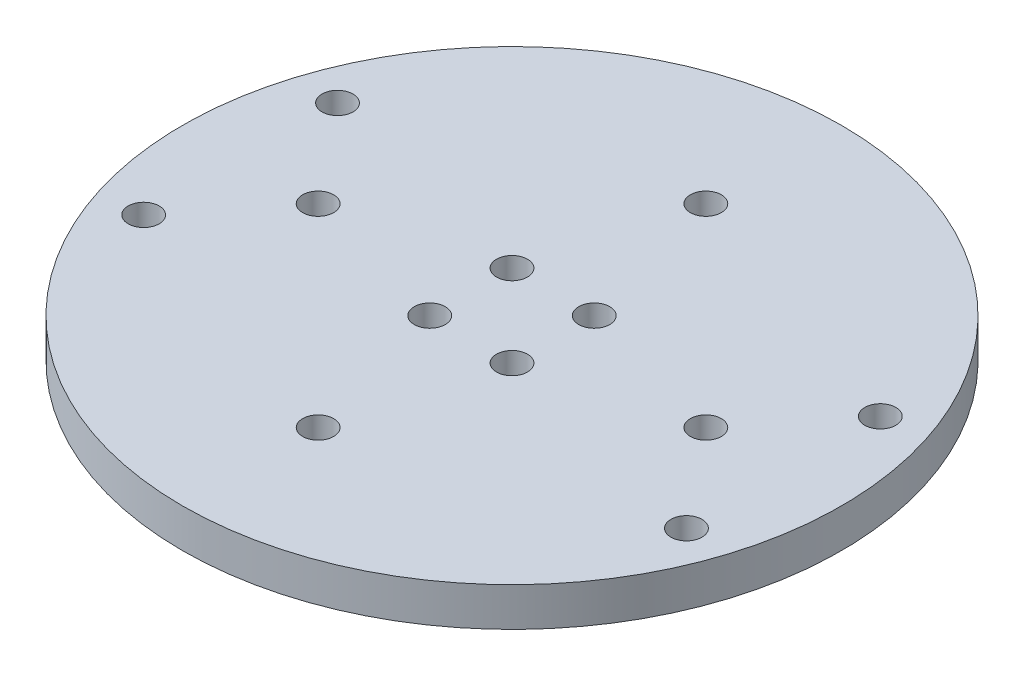
ISO-10303-21;
HEADER;
FILE_DESCRIPTION(('STEP AP214'),'2;1');
FILE_NAME('part.step','',(''),(''),'','','');
FILE_SCHEMA(('AUTOMOTIVE_DESIGN { 1 0 10303 214 1 1 1 1 }'));
ENDSEC;
DATA;
#1=APPLICATION_CONTEXT('core data for automotive mechanical design processes');
#2=APPLICATION_PROTOCOL_DEFINITION('international standard','automotive_design',2000,#1);
#3=PRODUCT_CONTEXT('',#1,'mechanical');
#4=PRODUCT('Part','Part','',(#3));
#5=PRODUCT_RELATED_PRODUCT_CATEGORY('part','',(#4));
#6=PRODUCT_DEFINITION_FORMATION('','',#4);
#7=PRODUCT_DEFINITION_CONTEXT('part definition',#1,'design');
#8=PRODUCT_DEFINITION('design','',#6,#7);
#9=PRODUCT_DEFINITION_SHAPE('','',#8);
#10=(LENGTH_UNIT() NAMED_UNIT(*) SI_UNIT(.MILLI.,.METRE.));
#11=(NAMED_UNIT(*) PLANE_ANGLE_UNIT() SI_UNIT($,.RADIAN.));
#12=(NAMED_UNIT(*) SI_UNIT($,.STERADIAN.) SOLID_ANGLE_UNIT());
#13=UNCERTAINTY_MEASURE_WITH_UNIT(LENGTH_MEASURE(1.E-05),#10,'distance_accuracy_value','');
#14=(GEOMETRIC_REPRESENTATION_CONTEXT(3) GLOBAL_UNCERTAINTY_ASSIGNED_CONTEXT((#13)) GLOBAL_UNIT_ASSIGNED_CONTEXT((#10,
#11,#12)) REPRESENTATION_CONTEXT('',''));
#15=CARTESIAN_POINT('',(0.,0.,0.));
#16=DIRECTION('',(0.,0.,1.));
#17=DIRECTION('',(1.,0.,0.));
#18=AXIS2_PLACEMENT_3D('',#15,#16,#17);
#19=CARTESIAN_POINT('',(0.,5.,0.));
#20=DIRECTION('',(0.,1.,0.));
#21=DIRECTION('',(0.,0.,1.));
#22=AXIS2_PLACEMENT_3D('',#19,#20,#21);
#23=PLANE('',#22);
#24=CARTESIAN_POINT('',(-35.,5.,12.5));
#25=DIRECTION('',(0.,1.,0.));
#26=DIRECTION('',(0.,0.,1.));
#27=AXIS2_PLACEMENT_3D('',#24,#25,#26);
#28=CIRCLE('',#27,2.);
#29=CARTESIAN_POINT('',(-35.,5.,14.5));
#30=VERTEX_POINT('',#29);
#31=EDGE_CURVE('E107',#30,#30,#28,.T.);
#32=ORIENTED_EDGE('',*,*,#31,.F.);
#33=EDGE_LOOP('',(#32));
#34=FACE_BOUND('',#33,.T.);
#35=CARTESIAN_POINT('',(35.,5.,-12.5));
#36=DIRECTION('',(0.,1.,0.));
#37=DIRECTION('',(0.,0.,1.));
#38=AXIS2_PLACEMENT_3D('',#35,#36,#37);
#39=CIRCLE('',#38,2.);
#40=CARTESIAN_POINT('',(35.,5.,-10.5));
#41=VERTEX_POINT('',#40);
#42=EDGE_CURVE('E111',#41,#41,#39,.T.);
#43=ORIENTED_EDGE('',*,*,#42,.F.);
#44=EDGE_LOOP('',(#43));
#45=FACE_BOUND('',#44,.T.);
#46=CARTESIAN_POINT('',(-25.,5.,0.));
#47=DIRECTION('',(0.,1.,0.));
#48=DIRECTION('',(0.,0.,1.));
#49=AXIS2_PLACEMENT_3D('',#46,#47,#48);
#50=CIRCLE('',#49,2.00000000000001);
#51=CARTESIAN_POINT('',(-25.,5.,2.00000000000001));
#52=VERTEX_POINT('',#51);
#53=EDGE_CURVE('E115',#52,#52,#50,.T.);
#54=ORIENTED_EDGE('',*,*,#53,.F.);
#55=EDGE_LOOP('',(#54));
#56=FACE_BOUND('',#55,.T.);
#57=CARTESIAN_POINT('',(-5.30330085889905,5.,-5.30330085889916));
#58=DIRECTION('',(0.,1.,0.));
#59=DIRECTION('',(0.,0.,1.));
#60=AXIS2_PLACEMENT_3D('',#57,#58,#59);
#61=CIRCLE('',#60,2.);
#62=CARTESIAN_POINT('',(-5.30330085889905,5.,-3.30330085889916));
#63=VERTEX_POINT('',#62);
#64=EDGE_CURVE('E119',#63,#63,#61,.T.);
#65=ORIENTED_EDGE('',*,*,#64,.F.);
#66=EDGE_LOOP('',(#65));
#67=FACE_BOUND('',#66,.T.);
#68=CARTESIAN_POINT('',(5.30330085889909,5.,5.30330085889913));
#69=DIRECTION('',(0.,1.,0.));
#70=DIRECTION('',(0.,0.,1.));
#71=AXIS2_PLACEMENT_3D('',#68,#69,#70);
#72=CIRCLE('',#71,2.);
#73=CARTESIAN_POINT('',(5.30330085889909,5.,7.30330085889913));
#74=VERTEX_POINT('',#73);
#75=EDGE_CURVE('E73',#74,#74,#72,.T.);
#76=ORIENTED_EDGE('',*,*,#75,.F.);
#77=EDGE_LOOP('',(#76));
#78=FACE_BOUND('',#77,.T.);
#79=CARTESIAN_POINT('',(5.30330085889911,5.,-5.30330085889911));
#80=DIRECTION('',(0.,1.,0.));
#81=DIRECTION('',(0.,0.,1.));
#82=AXIS2_PLACEMENT_3D('',#79,#80,#81);
#83=CIRCLE('',#82,2.);
#84=CARTESIAN_POINT('',(5.30330085889911,5.,-3.30330085889911));
#85=VERTEX_POINT('',#84);
#86=EDGE_CURVE('E51',#85,#85,#83,.T.);
#87=ORIENTED_EDGE('',*,*,#86,.F.);
#88=EDGE_LOOP('',(#87));
#89=FACE_BOUND('',#88,.T.);
#90=CARTESIAN_POINT('',(0.,5.,0.));
#91=DIRECTION('',(0.,1.,0.));
#92=DIRECTION('',(0.,0.,1.));
#93=AXIS2_PLACEMENT_3D('',#90,#91,#92);
#94=CIRCLE('',#93,42.5);
#95=CARTESIAN_POINT('',(0.,5.,42.5));
#96=VERTEX_POINT('',#95);
#97=EDGE_CURVE('E11',#96,#96,#94,.T.);
#98=ORIENTED_EDGE('',*,*,#97,.T.);
#99=EDGE_LOOP('',(#98));
#100=FACE_BOUND('',#99,.T.);
#101=CARTESIAN_POINT('',(25.,5.,0.));
#102=DIRECTION('',(0.,1.,0.));
#103=DIRECTION('',(0.,0.,1.));
#104=AXIS2_PLACEMENT_3D('',#101,#102,#103);
#105=CIRCLE('',#104,2.);
#106=CARTESIAN_POINT('',(25.,5.,2.));
#107=VERTEX_POINT('',#106);
#108=EDGE_CURVE('E64',#107,#107,#105,.T.);
#109=ORIENTED_EDGE('',*,*,#108,.F.);
#110=EDGE_LOOP('',(#109));
#111=FACE_BOUND('',#110,.T.);
#112=CARTESIAN_POINT('',(-5.30330085889914,5.,5.30330085889907));
#113=DIRECTION('',(0.,1.,0.));
#114=DIRECTION('',(0.,0.,1.));
#115=AXIS2_PLACEMENT_3D('',#112,#113,#114);
#116=CIRCLE('',#115,2.);
#117=CARTESIAN_POINT('',(-5.30330085889914,5.,7.30330085889907));
#118=VERTEX_POINT('',#117);
#119=EDGE_CURVE('E129',#118,#118,#116,.T.);
#120=ORIENTED_EDGE('',*,*,#119,.F.);
#121=EDGE_LOOP('',(#120));
#122=FACE_BOUND('',#121,.T.);
#123=CARTESIAN_POINT('',(0.,5.,25.));
#124=DIRECTION('',(0.,1.,0.));
#125=DIRECTION('',(0.,0.,1.));
#126=AXIS2_PLACEMENT_3D('',#123,#124,#125);
#127=CIRCLE('',#126,2.);
#128=CARTESIAN_POINT('',(0.,5.,27.));
#129=VERTEX_POINT('',#128);
#130=EDGE_CURVE('E133',#129,#129,#127,.T.);
#131=ORIENTED_EDGE('',*,*,#130,.F.);
#132=EDGE_LOOP('',(#131));
#133=FACE_BOUND('',#132,.T.);
#134=CARTESIAN_POINT('',(0.,5.,-25.));
#135=DIRECTION('',(0.,1.,0.));
#136=DIRECTION('',(0.,0.,1.));
#137=AXIS2_PLACEMENT_3D('',#134,#135,#136);
#138=CIRCLE('',#137,2.00000000000001);
#139=CARTESIAN_POINT('',(0.,5.,-23.));
#140=VERTEX_POINT('',#139);
#141=EDGE_CURVE('E137',#140,#140,#138,.T.);
#142=ORIENTED_EDGE('',*,*,#141,.F.);
#143=EDGE_LOOP('',(#142));
#144=FACE_BOUND('',#143,.T.);
#145=CARTESIAN_POINT('',(35.,5.,12.5));
#146=DIRECTION('',(0.,1.,0.));
#147=DIRECTION('',(0.,0.,1.));
#148=AXIS2_PLACEMENT_3D('',#145,#146,#147);
#149=CIRCLE('',#148,2.);
#150=CARTESIAN_POINT('',(35.,5.,14.5));
#151=VERTEX_POINT('',#150);
#152=EDGE_CURVE('E141',#151,#151,#149,.T.);
#153=ORIENTED_EDGE('',*,*,#152,.F.);
#154=EDGE_LOOP('',(#153));
#155=FACE_BOUND('',#154,.T.);
#156=CARTESIAN_POINT('',(-35.,5.,-12.5));
#157=DIRECTION('',(0.,1.,0.));
#158=DIRECTION('',(0.,0.,1.));
#159=AXIS2_PLACEMENT_3D('',#156,#157,#158);
#160=CIRCLE('',#159,2.);
#161=CARTESIAN_POINT('',(-35.,5.,-10.5));
#162=VERTEX_POINT('',#161);
#163=EDGE_CURVE('E144',#162,#162,#160,.T.);
#164=ORIENTED_EDGE('',*,*,#163,.F.);
#165=EDGE_LOOP('',(#164));
#166=FACE_BOUND('',#165,.T.);
#167=ADVANCED_FACE('F37',(#34,#45,#56,#67,#78,#89,#100,#111,#122,#133,#144,#155,#166),#23,.T.);
#168=CARTESIAN_POINT('',(0.,0.,0.));
#169=DIRECTION('',(0.,1.,0.));
#170=DIRECTION('',(0.,0.,1.));
#171=AXIS2_PLACEMENT_3D('',#168,#169,#170);
#172=PLANE('',#171);
#173=CARTESIAN_POINT('',(0.,0.,0.));
#174=DIRECTION('',(0.,1.,0.));
#175=DIRECTION('',(0.,0.,1.));
#176=AXIS2_PLACEMENT_3D('',#173,#174,#175);
#177=CIRCLE('',#176,42.5);
#178=CARTESIAN_POINT('',(0.,0.,42.5));
#179=VERTEX_POINT('',#178);
#180=EDGE_CURVE('E41',#179,#179,#177,.T.);
#181=ORIENTED_EDGE('',*,*,#180,.F.);
#182=EDGE_LOOP('',(#181));
#183=FACE_BOUND('',#182,.T.);
#184=CARTESIAN_POINT('',(5.30330085889911,0.,-5.30330085889911));
#185=DIRECTION('',(0.,1.,0.));
#186=DIRECTION('',(0.,0.,1.));
#187=AXIS2_PLACEMENT_3D('',#184,#185,#186);
#188=CIRCLE('',#187,2.);
#189=CARTESIAN_POINT('',(5.30330085889911,0.,-3.30330085889911));
#190=VERTEX_POINT('',#189);
#191=EDGE_CURVE('E54',#190,#190,#188,.T.);
#192=ORIENTED_EDGE('',*,*,#191,.T.);
#193=EDGE_LOOP('',(#192));
#194=FACE_BOUND('',#193,.T.);
#195=CARTESIAN_POINT('',(25.,0.,0.));
#196=DIRECTION('',(0.,1.,0.));
#197=DIRECTION('',(0.,0.,1.));
#198=AXIS2_PLACEMENT_3D('',#195,#196,#197);
#199=CIRCLE('',#198,2.);
#200=CARTESIAN_POINT('',(25.,0.,2.));
#201=VERTEX_POINT('',#200);
#202=EDGE_CURVE('E69',#201,#201,#199,.T.);
#203=ORIENTED_EDGE('',*,*,#202,.T.);
#204=EDGE_LOOP('',(#203));
#205=FACE_BOUND('',#204,.T.);
#206=CARTESIAN_POINT('',(5.30330085889909,0.,5.30330085889913));
#207=DIRECTION('',(0.,1.,0.));
#208=DIRECTION('',(0.,0.,1.));
#209=AXIS2_PLACEMENT_3D('',#206,#207,#208);
#210=CIRCLE('',#209,2.);
#211=CARTESIAN_POINT('',(5.30330085889909,0.,7.30330085889913));
#212=VERTEX_POINT('',#211);
#213=EDGE_CURVE('E70',#212,#212,#210,.T.);
#214=ORIENTED_EDGE('',*,*,#213,.T.);
#215=EDGE_LOOP('',(#214));
#216=FACE_BOUND('',#215,.T.);
#217=CARTESIAN_POINT('',(-5.30330085889914,0.,5.30330085889907));
#218=DIRECTION('',(0.,1.,0.));
#219=DIRECTION('',(0.,0.,1.));
#220=AXIS2_PLACEMENT_3D('',#217,#218,#219);
#221=CIRCLE('',#220,2.);
#222=CARTESIAN_POINT('',(-5.30330085889914,0.,7.30330085889907));
#223=VERTEX_POINT('',#222);
#224=EDGE_CURVE('E232',#223,#223,#221,.T.);
#225=ORIENTED_EDGE('',*,*,#224,.T.);
#226=EDGE_LOOP('',(#225));
#227=FACE_BOUND('',#226,.T.);
#228=CARTESIAN_POINT('',(-5.30330085889905,0.,-5.30330085889916));
#229=DIRECTION('',(0.,1.,0.));
#230=DIRECTION('',(0.,0.,1.));
#231=AXIS2_PLACEMENT_3D('',#228,#229,#230);
#232=CIRCLE('',#231,2.);
#233=CARTESIAN_POINT('',(-5.30330085889905,0.,-3.30330085889916));
#234=VERTEX_POINT('',#233);
#235=EDGE_CURVE('E238',#234,#234,#232,.T.);
#236=ORIENTED_EDGE('',*,*,#235,.T.);
#237=EDGE_LOOP('',(#236));
#238=FACE_BOUND('',#237,.T.);
#239=CARTESIAN_POINT('',(0.,0.,25.));
#240=DIRECTION('',(0.,1.,0.));
#241=DIRECTION('',(0.,0.,1.));
#242=AXIS2_PLACEMENT_3D('',#239,#240,#241);
#243=CIRCLE('',#242,2.);
#244=CARTESIAN_POINT('',(0.,0.,27.));
#245=VERTEX_POINT('',#244);
#246=EDGE_CURVE('E244',#245,#245,#243,.T.);
#247=ORIENTED_EDGE('',*,*,#246,.T.);
#248=EDGE_LOOP('',(#247));
#249=FACE_BOUND('',#248,.T.);
#250=CARTESIAN_POINT('',(-25.,0.,0.));
#251=DIRECTION('',(0.,1.,0.));
#252=DIRECTION('',(0.,0.,1.));
#253=AXIS2_PLACEMENT_3D('',#250,#251,#252);
#254=CIRCLE('',#253,2.00000000000001);
#255=CARTESIAN_POINT('',(-25.,0.,2.00000000000001));
#256=VERTEX_POINT('',#255);
#257=EDGE_CURVE('E177',#256,#256,#254,.T.);
#258=ORIENTED_EDGE('',*,*,#257,.T.);
#259=EDGE_LOOP('',(#258));
#260=FACE_BOUND('',#259,.T.);
#261=CARTESIAN_POINT('',(0.,0.,-25.));
#262=DIRECTION('',(0.,1.,0.));
#263=DIRECTION('',(0.,0.,1.));
#264=AXIS2_PLACEMENT_3D('',#261,#262,#263);
#265=CIRCLE('',#264,2.00000000000001);
#266=CARTESIAN_POINT('',(0.,0.,-23.));
#267=VERTEX_POINT('',#266);
#268=EDGE_CURVE('E170',#267,#267,#265,.T.);
#269=ORIENTED_EDGE('',*,*,#268,.T.);
#270=EDGE_LOOP('',(#269));
#271=FACE_BOUND('',#270,.T.);
#272=CARTESIAN_POINT('',(35.,0.,-12.5));
#273=DIRECTION('',(0.,1.,0.));
#274=DIRECTION('',(0.,0.,1.));
#275=AXIS2_PLACEMENT_3D('',#272,#273,#274);
#276=CIRCLE('',#275,2.);
#277=CARTESIAN_POINT('',(35.,0.,-10.5));
#278=VERTEX_POINT('',#277);
#279=EDGE_CURVE('E171',#278,#278,#276,.T.);
#280=ORIENTED_EDGE('',*,*,#279,.T.);
#281=EDGE_LOOP('',(#280));
#282=FACE_BOUND('',#281,.T.);
#283=CARTESIAN_POINT('',(35.,0.,12.5));
#284=DIRECTION('',(0.,1.,0.));
#285=DIRECTION('',(0.,0.,1.));
#286=AXIS2_PLACEMENT_3D('',#283,#284,#285);
#287=CIRCLE('',#286,2.);
#288=CARTESIAN_POINT('',(35.,0.,14.5));
#289=VERTEX_POINT('',#288);
#290=EDGE_CURVE('E158',#289,#289,#287,.T.);
#291=ORIENTED_EDGE('',*,*,#290,.T.);
#292=EDGE_LOOP('',(#291));
#293=FACE_BOUND('',#292,.T.);
#294=CARTESIAN_POINT('',(-35.,0.,12.5));
#295=DIRECTION('',(0.,1.,0.));
#296=DIRECTION('',(0.,0.,1.));
#297=AXIS2_PLACEMENT_3D('',#294,#295,#296);
#298=CIRCLE('',#297,2.);
#299=CARTESIAN_POINT('',(-35.,0.,14.5));
#300=VERTEX_POINT('',#299);
#301=EDGE_CURVE('E147',#300,#300,#298,.T.);
#302=ORIENTED_EDGE('',*,*,#301,.T.);
#303=EDGE_LOOP('',(#302));
#304=FACE_BOUND('',#303,.T.);
#305=CARTESIAN_POINT('',(-35.,0.,-12.5));
#306=DIRECTION('',(0.,1.,0.));
#307=DIRECTION('',(0.,0.,1.));
#308=AXIS2_PLACEMENT_3D('',#305,#306,#307);
#309=CIRCLE('',#308,2.);
#310=CARTESIAN_POINT('',(-35.,0.,-10.5));
#311=VERTEX_POINT('',#310);
#312=EDGE_CURVE('E148',#311,#311,#309,.T.);
#313=ORIENTED_EDGE('',*,*,#312,.T.);
#314=EDGE_LOOP('',(#313));
#315=FACE_BOUND('',#314,.T.);
#316=ADVANCED_FACE('F82',(#183,#194,#205,#216,#227,#238,#249,#260,#271,#282,#293,#304,#315),
#172,.F.);
#317=CARTESIAN_POINT('',(0.,5.,0.));
#318=DIRECTION('',(0.,-1.,0.));
#319=DIRECTION('',(0.,0.,-1.));
#320=AXIS2_PLACEMENT_3D('',#317,#318,#319);
#321=CYLINDRICAL_SURFACE('',#320,42.5);
#322=ORIENTED_EDGE('',*,*,#97,.F.);
#323=EDGE_LOOP('',(#322));
#324=FACE_BOUND('',#323,.T.);
#325=ORIENTED_EDGE('',*,*,#180,.T.);
#326=EDGE_LOOP('',(#325));
#327=FACE_BOUND('',#326,.T.);
#328=ADVANCED_FACE('F39',(#324,#327),#321,.T.);
#329=CARTESIAN_POINT('',(5.30330085889911,5.,-5.30330085889911));
#330=DIRECTION('',(0.,-1.,0.));
#331=DIRECTION('',(0.,0.,-1.));
#332=AXIS2_PLACEMENT_3D('',#329,#330,#331);
#333=CYLINDRICAL_SURFACE('',#332,2.);
#334=ORIENTED_EDGE('',*,*,#86,.T.);
#335=EDGE_LOOP('',(#334));
#336=FACE_BOUND('',#335,.T.);
#337=ORIENTED_EDGE('',*,*,#191,.F.);
#338=EDGE_LOOP('',(#337));
#339=FACE_BOUND('',#338,.T.);
#340=ADVANCED_FACE('F85',(#336,#339),#333,.F.);
#341=CARTESIAN_POINT('',(25.,5.,0.));
#342=DIRECTION('',(0.,-1.,0.));
#343=DIRECTION('',(0.,0.,-1.));
#344=AXIS2_PLACEMENT_3D('',#341,#342,#343);
#345=CYLINDRICAL_SURFACE('',#344,2.);
#346=ORIENTED_EDGE('',*,*,#108,.T.);
#347=EDGE_LOOP('',(#346));
#348=FACE_BOUND('',#347,.T.);
#349=ORIENTED_EDGE('',*,*,#202,.F.);
#350=EDGE_LOOP('',(#349));
#351=FACE_BOUND('',#350,.T.);
#352=ADVANCED_FACE('F87',(#348,#351),#345,.F.);
#353=CARTESIAN_POINT('',(5.30330085889909,5.,5.30330085889913));
#354=DIRECTION('',(0.,-1.,0.));
#355=DIRECTION('',(0.,0.,-1.));
#356=AXIS2_PLACEMENT_3D('',#353,#354,#355);
#357=CYLINDRICAL_SURFACE('',#356,2.);
#358=ORIENTED_EDGE('',*,*,#75,.T.);
#359=EDGE_LOOP('',(#358));
#360=FACE_BOUND('',#359,.T.);
#361=ORIENTED_EDGE('',*,*,#213,.F.);
#362=EDGE_LOOP('',(#361));
#363=FACE_BOUND('',#362,.T.);
#364=ADVANCED_FACE('F93',(#360,#363),#357,.F.);
#365=CARTESIAN_POINT('',(-5.30330085889914,5.,5.30330085889907));
#366=DIRECTION('',(0.,-1.,0.));
#367=DIRECTION('',(0.,0.,-1.));
#368=AXIS2_PLACEMENT_3D('',#365,#366,#367);
#369=CYLINDRICAL_SURFACE('',#368,2.);
#370=ORIENTED_EDGE('',*,*,#119,.T.);
#371=EDGE_LOOP('',(#370));
#372=FACE_BOUND('',#371,.T.);
#373=ORIENTED_EDGE('',*,*,#224,.F.);
#374=EDGE_LOOP('',(#373));
#375=FACE_BOUND('',#374,.T.);
#376=ADVANCED_FACE('F218',(#372,#375),#369,.F.);
#377=CARTESIAN_POINT('',(-5.30330085889905,5.,-5.30330085889916));
#378=DIRECTION('',(0.,-1.,0.));
#379=DIRECTION('',(0.,0.,-1.));
#380=AXIS2_PLACEMENT_3D('',#377,#378,#379);
#381=CYLINDRICAL_SURFACE('',#380,2.);
#382=ORIENTED_EDGE('',*,*,#64,.T.);
#383=EDGE_LOOP('',(#382));
#384=FACE_BOUND('',#383,.T.);
#385=ORIENTED_EDGE('',*,*,#235,.F.);
#386=EDGE_LOOP('',(#385));
#387=FACE_BOUND('',#386,.T.);
#388=ADVANCED_FACE('F214',(#384,#387),#381,.F.);
#389=CARTESIAN_POINT('',(0.,5.,25.));
#390=DIRECTION('',(0.,-1.,0.));
#391=DIRECTION('',(0.,0.,-1.));
#392=AXIS2_PLACEMENT_3D('',#389,#390,#391);
#393=CYLINDRICAL_SURFACE('',#392,2.);
#394=ORIENTED_EDGE('',*,*,#130,.T.);
#395=EDGE_LOOP('',(#394));
#396=FACE_BOUND('',#395,.T.);
#397=ORIENTED_EDGE('',*,*,#246,.F.);
#398=EDGE_LOOP('',(#397));
#399=FACE_BOUND('',#398,.T.);
#400=ADVANCED_FACE('F210',(#396,#399),#393,.F.);
#401=CARTESIAN_POINT('',(-25.,5.,0.));
#402=DIRECTION('',(0.,-1.,0.));
#403=DIRECTION('',(0.,0.,-1.));
#404=AXIS2_PLACEMENT_3D('',#401,#402,#403);
#405=CYLINDRICAL_SURFACE('',#404,2.00000000000001);
#406=ORIENTED_EDGE('',*,*,#53,.T.);
#407=EDGE_LOOP('',(#406));
#408=FACE_BOUND('',#407,.T.);
#409=ORIENTED_EDGE('',*,*,#257,.F.);
#410=EDGE_LOOP('',(#409));
#411=FACE_BOUND('',#410,.T.);
#412=ADVANCED_FACE('F206',(#408,#411),#405,.F.);
#413=CARTESIAN_POINT('',(0.,5.,-25.));
#414=DIRECTION('',(0.,-1.,0.));
#415=DIRECTION('',(0.,0.,-1.));
#416=AXIS2_PLACEMENT_3D('',#413,#414,#415);
#417=CYLINDRICAL_SURFACE('',#416,2.00000000000001);
#418=ORIENTED_EDGE('',*,*,#141,.T.);
#419=EDGE_LOOP('',(#418));
#420=FACE_BOUND('',#419,.T.);
#421=ORIENTED_EDGE('',*,*,#268,.F.);
#422=EDGE_LOOP('',(#421));
#423=FACE_BOUND('',#422,.T.);
#424=ADVANCED_FACE('F199',(#420,#423),#417,.F.);
#425=CARTESIAN_POINT('',(35.,5.,-12.5));
#426=DIRECTION('',(0.,-1.,0.));
#427=DIRECTION('',(0.,0.,-1.));
#428=AXIS2_PLACEMENT_3D('',#425,#426,#427);
#429=CYLINDRICAL_SURFACE('',#428,2.);
#430=ORIENTED_EDGE('',*,*,#42,.T.);
#431=EDGE_LOOP('',(#430));
#432=FACE_BOUND('',#431,.T.);
#433=ORIENTED_EDGE('',*,*,#279,.F.);
#434=EDGE_LOOP('',(#433));
#435=FACE_BOUND('',#434,.T.);
#436=ADVANCED_FACE('F190',(#432,#435),#429,.F.);
#437=CARTESIAN_POINT('',(35.,5.,12.5));
#438=DIRECTION('',(0.,-1.,0.));
#439=DIRECTION('',(0.,0.,-1.));
#440=AXIS2_PLACEMENT_3D('',#437,#438,#439);
#441=CYLINDRICAL_SURFACE('',#440,2.);
#442=ORIENTED_EDGE('',*,*,#152,.T.);
#443=EDGE_LOOP('',(#442));
#444=FACE_BOUND('',#443,.T.);
#445=ORIENTED_EDGE('',*,*,#290,.F.);
#446=EDGE_LOOP('',(#445));
#447=FACE_BOUND('',#446,.T.);
#448=ADVANCED_FACE('F187',(#444,#447),#441,.F.);
#449=CARTESIAN_POINT('',(-35.,5.,12.5));
#450=DIRECTION('',(0.,-1.,0.));
#451=DIRECTION('',(0.,0.,-1.));
#452=AXIS2_PLACEMENT_3D('',#449,#450,#451);
#453=CYLINDRICAL_SURFACE('',#452,2.);
#454=ORIENTED_EDGE('',*,*,#31,.T.);
#455=EDGE_LOOP('',(#454));
#456=FACE_BOUND('',#455,.T.);
#457=ORIENTED_EDGE('',*,*,#301,.F.);
#458=EDGE_LOOP('',(#457));
#459=FACE_BOUND('',#458,.T.);
#460=ADVANCED_FACE('F189',(#456,#459),#453,.F.);
#461=CARTESIAN_POINT('',(-35.,5.,-12.5));
#462=DIRECTION('',(0.,-1.,0.));
#463=DIRECTION('',(0.,0.,-1.));
#464=AXIS2_PLACEMENT_3D('',#461,#462,#463);
#465=CYLINDRICAL_SURFACE('',#464,2.);
#466=ORIENTED_EDGE('',*,*,#163,.T.);
#467=EDGE_LOOP('',(#466));
#468=FACE_BOUND('',#467,.T.);
#469=ORIENTED_EDGE('',*,*,#312,.F.);
#470=EDGE_LOOP('',(#469));
#471=FACE_BOUND('',#470,.T.);
#472=ADVANCED_FACE('F196',(#468,#471),#465,.F.);
#473=CLOSED_SHELL('',(#167,#316,#328,#340,#352,#364,#376,#388,#400,#412,#424,#436,#448,#460,#472));
#474=MANIFOLD_SOLID_BREP('B2',#473);
#475=ADVANCED_BREP_SHAPE_REPRESENTATION('',(#18,#474),#14);
#476=SHAPE_DEFINITION_REPRESENTATION(#9,#475);
ENDSEC;
END-ISO-10303-21;
